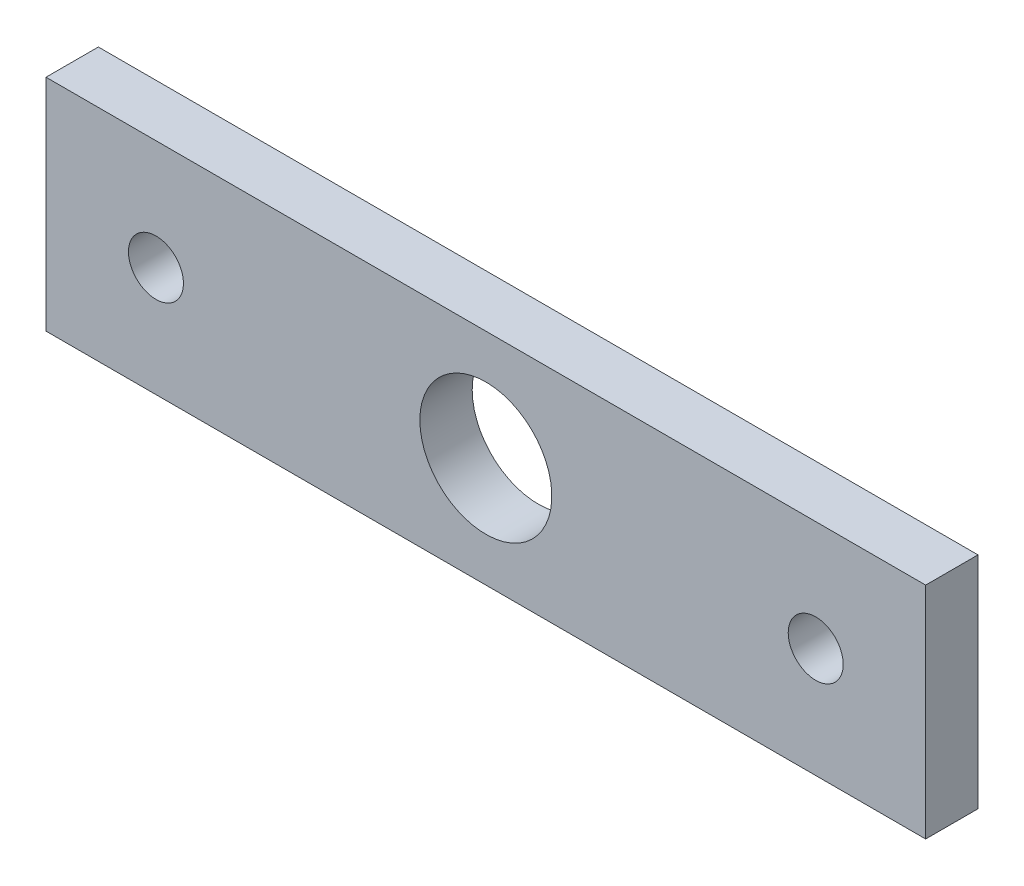
ISO-10303-21;
HEADER;
FILE_DESCRIPTION(('STEP AP214'),'2;1');
FILE_NAME('part.step','',(''),(''),'','','');
FILE_SCHEMA(('AUTOMOTIVE_DESIGN { 1 0 10303 214 1 1 1 1 }'));
ENDSEC;
DATA;
#1=APPLICATION_CONTEXT('core data for automotive mechanical design processes');
#2=APPLICATION_PROTOCOL_DEFINITION('international standard','automotive_design',2000,#1);
#3=PRODUCT_CONTEXT('',#1,'mechanical');
#4=PRODUCT('Part','Part','',(#3));
#5=PRODUCT_RELATED_PRODUCT_CATEGORY('part','',(#4));
#6=PRODUCT_DEFINITION_FORMATION('','',#4);
#7=PRODUCT_DEFINITION_CONTEXT('part definition',#1,'design');
#8=PRODUCT_DEFINITION('design','',#6,#7);
#9=PRODUCT_DEFINITION_SHAPE('','',#8);
#10=(LENGTH_UNIT() NAMED_UNIT(*) SI_UNIT(.MILLI.,.METRE.));
#11=(NAMED_UNIT(*) PLANE_ANGLE_UNIT() SI_UNIT($,.RADIAN.));
#12=(NAMED_UNIT(*) SI_UNIT($,.STERADIAN.) SOLID_ANGLE_UNIT());
#13=UNCERTAINTY_MEASURE_WITH_UNIT(LENGTH_MEASURE(1.E-05),#10,'distance_accuracy_value','');
#14=(GEOMETRIC_REPRESENTATION_CONTEXT(3) GLOBAL_UNCERTAINTY_ASSIGNED_CONTEXT((#13)) GLOBAL_UNIT_ASSIGNED_CONTEXT((#10,
#11,#12)) REPRESENTATION_CONTEXT('',''));
#15=CARTESIAN_POINT('',(0.,0.,0.));
#16=DIRECTION('',(0.,0.,1.));
#17=DIRECTION('',(1.,0.,0.));
#18=AXIS2_PLACEMENT_3D('',#15,#16,#17);
#19=CARTESIAN_POINT('',(80.,0.,0.));
#20=DIRECTION('',(1.,0.,0.));
#21=DIRECTION('',(0.,0.,-1.));
#22=AXIS2_PLACEMENT_3D('',#19,#20,#21);
#23=PLANE('',#22);
#24=DIRECTION('',(0.,1.,0.));
#25=VECTOR('',#24,1.);
#26=CARTESIAN_POINT('',(80.,0.,4.76));
#27=LINE('',#26,#25);
#28=CARTESIAN_POINT('',(80.,0.,4.76));
#29=VERTEX_POINT('',#28);
#30=CARTESIAN_POINT('',(80.,20.,4.76));
#31=VERTEX_POINT('',#30);
#32=EDGE_CURVE('E98',#29,#31,#27,.T.);
#33=ORIENTED_EDGE('',*,*,#32,.F.);
#34=DIRECTION('',(0.,0.,1.));
#35=VECTOR('',#34,1.);
#36=CARTESIAN_POINT('',(80.,0.,0.));
#37=LINE('',#36,#35);
#38=CARTESIAN_POINT('',(80.,0.,0.));
#39=VERTEX_POINT('',#38);
#40=EDGE_CURVE('E11',#39,#29,#37,.T.);
#41=ORIENTED_EDGE('',*,*,#40,.F.);
#42=DIRECTION('',(0.,1.,0.));
#43=VECTOR('',#42,1.);
#44=CARTESIAN_POINT('',(80.,0.,0.));
#45=LINE('',#44,#43);
#46=CARTESIAN_POINT('',(80.,20.,0.));
#47=VERTEX_POINT('',#46);
#48=EDGE_CURVE('E91',#39,#47,#45,.T.);
#49=ORIENTED_EDGE('',*,*,#48,.T.);
#50=DIRECTION('',(0.,0.,1.));
#51=VECTOR('',#50,1.);
#52=CARTESIAN_POINT('',(80.,20.,0.));
#53=LINE('',#52,#51);
#54=EDGE_CURVE('E36',#47,#31,#53,.T.);
#55=ORIENTED_EDGE('',*,*,#54,.T.);
#56=EDGE_LOOP('',(#33,#41,#49,#55));
#57=FACE_BOUND('',#56,.T.);
#58=ADVANCED_FACE('F33',(#57),#23,.T.);
#59=CARTESIAN_POINT('',(0.,0.,0.));
#60=DIRECTION('',(0.,-1.,0.));
#61=DIRECTION('',(0.,0.,-1.));
#62=AXIS2_PLACEMENT_3D('',#59,#60,#61);
#63=PLANE('',#62);
#64=DIRECTION('',(1.,0.,0.));
#65=VECTOR('',#64,1.);
#66=CARTESIAN_POINT('',(0.,0.,4.76));
#67=LINE('',#66,#65);
#68=CARTESIAN_POINT('',(0.,0.,4.76));
#69=VERTEX_POINT('',#68);
#70=EDGE_CURVE('E93',#69,#29,#67,.T.);
#71=ORIENTED_EDGE('',*,*,#70,.F.);
#72=DIRECTION('',(0.,0.,1.));
#73=VECTOR('',#72,1.);
#74=CARTESIAN_POINT('',(0.,0.,0.));
#75=LINE('',#74,#73);
#76=CARTESIAN_POINT('',(0.,0.,0.));
#77=VERTEX_POINT('',#76);
#78=EDGE_CURVE('E42',#77,#69,#75,.T.);
#79=ORIENTED_EDGE('',*,*,#78,.F.);
#80=DIRECTION('',(1.,0.,0.));
#81=VECTOR('',#80,1.);
#82=CARTESIAN_POINT('',(0.,0.,0.));
#83=LINE('',#82,#81);
#84=EDGE_CURVE('E88',#77,#39,#83,.T.);
#85=ORIENTED_EDGE('',*,*,#84,.T.);
#86=ORIENTED_EDGE('',*,*,#40,.T.);
#87=EDGE_LOOP('',(#71,#79,#85,#86));
#88=FACE_BOUND('',#87,.T.);
#89=ADVANCED_FACE('F109',(#88),#63,.T.);
#90=CARTESIAN_POINT('',(0.,20.,0.));
#91=DIRECTION('',(-1.,0.,0.));
#92=DIRECTION('',(0.,0.,1.));
#93=AXIS2_PLACEMENT_3D('',#90,#91,#92);
#94=PLANE('',#93);
#95=DIRECTION('',(0.,-1.,0.));
#96=VECTOR('',#95,1.);
#97=CARTESIAN_POINT('',(0.,20.,4.76));
#98=LINE('',#97,#96);
#99=CARTESIAN_POINT('',(0.,20.,4.76));
#100=VERTEX_POINT('',#99);
#101=EDGE_CURVE('E83',#100,#69,#98,.T.);
#102=ORIENTED_EDGE('',*,*,#101,.F.);
#103=DIRECTION('',(0.,0.,1.));
#104=VECTOR('',#103,1.);
#105=CARTESIAN_POINT('',(0.,20.,0.));
#106=LINE('',#105,#104);
#107=CARTESIAN_POINT('',(0.,20.,0.));
#108=VERTEX_POINT('',#107);
#109=EDGE_CURVE('E78',#108,#100,#106,.T.);
#110=ORIENTED_EDGE('',*,*,#109,.F.);
#111=DIRECTION('',(0.,-1.,0.));
#112=VECTOR('',#111,1.);
#113=CARTESIAN_POINT('',(0.,20.,0.));
#114=LINE('',#113,#112);
#115=EDGE_CURVE('E81',#108,#77,#114,.T.);
#116=ORIENTED_EDGE('',*,*,#115,.T.);
#117=ORIENTED_EDGE('',*,*,#78,.T.);
#118=EDGE_LOOP('',(#102,#110,#116,#117));
#119=FACE_BOUND('',#118,.T.);
#120=ADVANCED_FACE('F80',(#119),#94,.T.);
#121=CARTESIAN_POINT('',(80.,20.,0.));
#122=DIRECTION('',(0.,1.,0.));
#123=DIRECTION('',(0.,0.,1.));
#124=AXIS2_PLACEMENT_3D('',#121,#122,#123);
#125=PLANE('',#124);
#126=DIRECTION('',(-1.,0.,0.));
#127=VECTOR('',#126,1.);
#128=CARTESIAN_POINT('',(80.,20.,4.76));
#129=LINE('',#128,#127);
#130=EDGE_CURVE('E101',#31,#100,#129,.T.);
#131=ORIENTED_EDGE('',*,*,#130,.F.);
#132=ORIENTED_EDGE('',*,*,#54,.F.);
#133=DIRECTION('',(-1.,0.,0.));
#134=VECTOR('',#133,1.);
#135=CARTESIAN_POINT('',(80.,20.,0.));
#136=LINE('',#135,#134);
#137=EDGE_CURVE('E87',#47,#108,#136,.T.);
#138=ORIENTED_EDGE('',*,*,#137,.T.);
#139=ORIENTED_EDGE('',*,*,#109,.T.);
#140=EDGE_LOOP('',(#131,#132,#138,#139));
#141=FACE_BOUND('',#140,.T.);
#142=ADVANCED_FACE('F90',(#141),#125,.T.);
#143=CARTESIAN_POINT('',(0.,0.,0.));
#144=DIRECTION('',(0.,0.,1.));
#145=DIRECTION('',(1.,0.,0.));
#146=AXIS2_PLACEMENT_3D('',#143,#144,#145);
#147=PLANE('',#146);
#148=CARTESIAN_POINT('',(40.,10.,0.));
#149=DIRECTION('',(0.,0.,1.));
#150=DIRECTION('',(-1.,0.,0.));
#151=AXIS2_PLACEMENT_3D('',#148,#149,#150);
#152=CIRCLE('',#151,6.);
#153=CARTESIAN_POINT('',(34.,10.,0.));
#154=VERTEX_POINT('',#153);
#155=EDGE_CURVE('E146',#154,#154,#152,.T.);
#156=ORIENTED_EDGE('',*,*,#155,.T.);
#157=EDGE_LOOP('',(#156));
#158=FACE_BOUND('',#157,.T.);
#159=CARTESIAN_POINT('',(70.,10.,0.));
#160=DIRECTION('',(0.,0.,1.));
#161=DIRECTION('',(-1.,0.,0.));
#162=AXIS2_PLACEMENT_3D('',#159,#160,#161);
#163=CIRCLE('',#162,2.5);
#164=CARTESIAN_POINT('',(67.5,10.,0.));
#165=VERTEX_POINT('',#164);
#166=EDGE_CURVE('E154',#165,#165,#163,.T.);
#167=ORIENTED_EDGE('',*,*,#166,.T.);
#168=EDGE_LOOP('',(#167));
#169=FACE_BOUND('',#168,.T.);
#170=CARTESIAN_POINT('',(10.,10.,0.));
#171=DIRECTION('',(0.,0.,1.));
#172=DIRECTION('',(-1.,0.,0.));
#173=AXIS2_PLACEMENT_3D('',#170,#171,#172);
#174=CIRCLE('',#173,2.5);
#175=CARTESIAN_POINT('',(7.5,10.,0.));
#176=VERTEX_POINT('',#175);
#177=EDGE_CURVE('E102',#176,#176,#174,.T.);
#178=ORIENTED_EDGE('',*,*,#177,.T.);
#179=EDGE_LOOP('',(#178));
#180=FACE_BOUND('',#179,.T.);
#181=ORIENTED_EDGE('',*,*,#48,.F.);
#182=ORIENTED_EDGE('',*,*,#84,.F.);
#183=ORIENTED_EDGE('',*,*,#115,.F.);
#184=ORIENTED_EDGE('',*,*,#137,.F.);
#185=EDGE_LOOP('',(#181,#182,#183,#184));
#186=FACE_BOUND('',#185,.T.);
#187=ADVANCED_FACE('F86',(#158,#169,#180,#186),#147,.F.);
#188=CARTESIAN_POINT('',(0.,0.,4.76));
#189=DIRECTION('',(0.,0.,1.));
#190=DIRECTION('',(1.,0.,0.));
#191=AXIS2_PLACEMENT_3D('',#188,#189,#190);
#192=PLANE('',#191);
#193=CARTESIAN_POINT('',(40.,10.,4.76));
#194=DIRECTION('',(0.,0.,1.));
#195=DIRECTION('',(-1.,0.,0.));
#196=AXIS2_PLACEMENT_3D('',#193,#194,#195);
#197=CIRCLE('',#196,6.);
#198=CARTESIAN_POINT('',(34.,10.,4.76));
#199=VERTEX_POINT('',#198);
#200=EDGE_CURVE('E149',#199,#199,#197,.T.);
#201=ORIENTED_EDGE('',*,*,#200,.F.);
#202=EDGE_LOOP('',(#201));
#203=FACE_BOUND('',#202,.T.);
#204=CARTESIAN_POINT('',(70.,10.,4.76));
#205=DIRECTION('',(0.,0.,1.));
#206=DIRECTION('',(-1.,0.,0.));
#207=AXIS2_PLACEMENT_3D('',#204,#205,#206);
#208=CIRCLE('',#207,2.5);
#209=CARTESIAN_POINT('',(67.5,10.,4.76));
#210=VERTEX_POINT('',#209);
#211=EDGE_CURVE('E151',#210,#210,#208,.T.);
#212=ORIENTED_EDGE('',*,*,#211,.F.);
#213=EDGE_LOOP('',(#212));
#214=FACE_BOUND('',#213,.T.);
#215=CARTESIAN_POINT('',(10.,10.,4.76));
#216=DIRECTION('',(0.,0.,1.));
#217=DIRECTION('',(-1.,0.,0.));
#218=AXIS2_PLACEMENT_3D('',#215,#216,#217);
#219=CIRCLE('',#218,2.5);
#220=CARTESIAN_POINT('',(7.5,10.,4.76));
#221=VERTEX_POINT('',#220);
#222=EDGE_CURVE('E157',#221,#221,#219,.T.);
#223=ORIENTED_EDGE('',*,*,#222,.F.);
#224=EDGE_LOOP('',(#223));
#225=FACE_BOUND('',#224,.T.);
#226=ORIENTED_EDGE('',*,*,#32,.T.);
#227=ORIENTED_EDGE('',*,*,#130,.T.);
#228=ORIENTED_EDGE('',*,*,#101,.T.);
#229=ORIENTED_EDGE('',*,*,#70,.T.);
#230=EDGE_LOOP('',(#226,#227,#228,#229));
#231=FACE_BOUND('',#230,.T.);
#232=ADVANCED_FACE('F108',(#203,#214,#225,#231),#192,.T.);
#233=CARTESIAN_POINT('',(10.,10.,0.));
#234=DIRECTION('',(0.,0.,1.));
#235=DIRECTION('',(1.,0.,0.));
#236=AXIS2_PLACEMENT_3D('',#233,#234,#235);
#237=CYLINDRICAL_SURFACE('',#236,2.5);
#238=ORIENTED_EDGE('',*,*,#177,.F.);
#239=EDGE_LOOP('',(#238));
#240=FACE_BOUND('',#239,.T.);
#241=ORIENTED_EDGE('',*,*,#222,.T.);
#242=EDGE_LOOP('',(#241));
#243=FACE_BOUND('',#242,.T.);
#244=ADVANCED_FACE('F127',(#240,#243),#237,.F.);
#245=CARTESIAN_POINT('',(70.,10.,0.));
#246=DIRECTION('',(0.,0.,1.));
#247=DIRECTION('',(1.,0.,0.));
#248=AXIS2_PLACEMENT_3D('',#245,#246,#247);
#249=CYLINDRICAL_SURFACE('',#248,2.5);
#250=ORIENTED_EDGE('',*,*,#166,.F.);
#251=EDGE_LOOP('',(#250));
#252=FACE_BOUND('',#251,.T.);
#253=ORIENTED_EDGE('',*,*,#211,.T.);
#254=EDGE_LOOP('',(#253));
#255=FACE_BOUND('',#254,.T.);
#256=ADVANCED_FACE('F134',(#252,#255),#249,.F.);
#257=CARTESIAN_POINT('',(40.,10.,0.));
#258=DIRECTION('',(0.,0.,1.));
#259=DIRECTION('',(1.,0.,0.));
#260=AXIS2_PLACEMENT_3D('',#257,#258,#259);
#261=CYLINDRICAL_SURFACE('',#260,6.);
#262=ORIENTED_EDGE('',*,*,#155,.F.);
#263=EDGE_LOOP('',(#262));
#264=FACE_BOUND('',#263,.T.);
#265=ORIENTED_EDGE('',*,*,#200,.T.);
#266=EDGE_LOOP('',(#265));
#267=FACE_BOUND('',#266,.T.);
#268=ADVANCED_FACE('F138',(#264,#267),#261,.F.);
#269=CLOSED_SHELL('',(#58,#89,#120,#142,#187,#232,#244,#256,#268));
#270=MANIFOLD_SOLID_BREP('B2',#269);
#271=ADVANCED_BREP_SHAPE_REPRESENTATION('',(#18,#270),#14);
#272=SHAPE_DEFINITION_REPRESENTATION(#9,#271);
ENDSEC;
END-ISO-10303-21;
